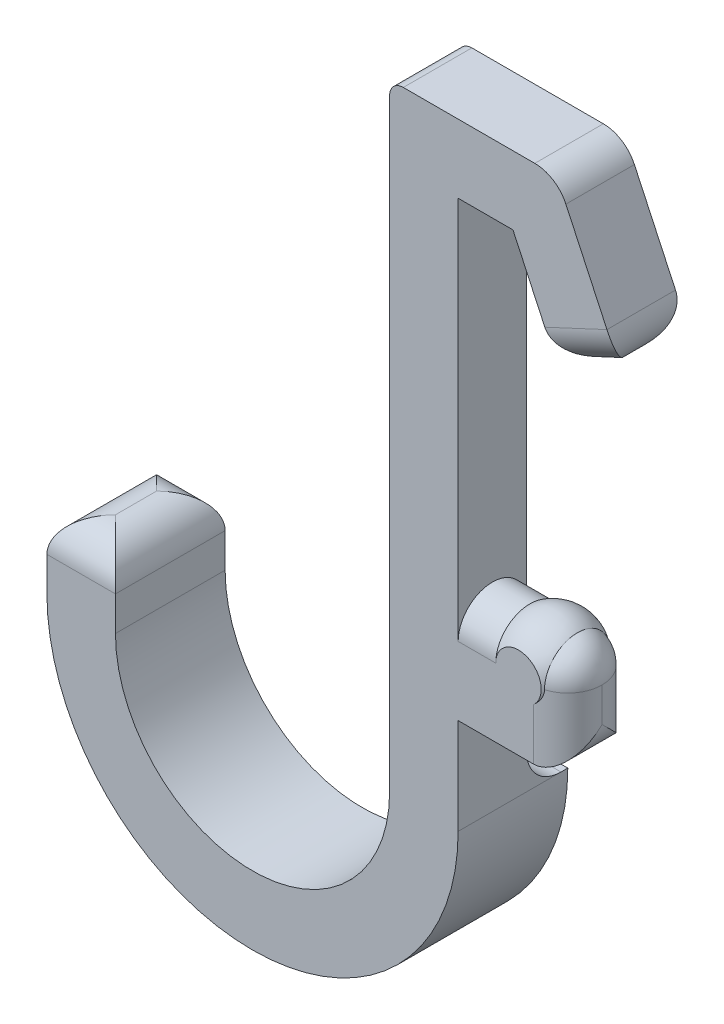
ISO-10303-21;
HEADER;
FILE_DESCRIPTION(('STEP AP214'),'2;1');
FILE_NAME('part.step','',(''),(''),'','','');
FILE_SCHEMA(('AUTOMOTIVE_DESIGN { 1 0 10303 214 1 1 1 1 }'));
ENDSEC;
DATA;
#1=APPLICATION_CONTEXT('core data for automotive mechanical design processes');
#2=APPLICATION_PROTOCOL_DEFINITION('international standard','automotive_design',2000,#1);
#3=PRODUCT_CONTEXT('',#1,'mechanical');
#4=PRODUCT('Part','Part','',(#3));
#5=PRODUCT_RELATED_PRODUCT_CATEGORY('part','',(#4));
#6=PRODUCT_DEFINITION_FORMATION('','',#4);
#7=PRODUCT_DEFINITION_CONTEXT('part definition',#1,'design');
#8=PRODUCT_DEFINITION('design','',#6,#7);
#9=PRODUCT_DEFINITION_SHAPE('','',#8);
#10=(LENGTH_UNIT() NAMED_UNIT(*) SI_UNIT(.MILLI.,.METRE.));
#11=(NAMED_UNIT(*) PLANE_ANGLE_UNIT() SI_UNIT($,.RADIAN.));
#12=(NAMED_UNIT(*) SI_UNIT($,.STERADIAN.) SOLID_ANGLE_UNIT());
#13=UNCERTAINTY_MEASURE_WITH_UNIT(LENGTH_MEASURE(1.E-05),#10,'distance_accuracy_value','');
#14=(GEOMETRIC_REPRESENTATION_CONTEXT(3) GLOBAL_UNCERTAINTY_ASSIGNED_CONTEXT((#13)) GLOBAL_UNIT_ASSIGNED_CONTEXT((#10,
#11,#12)) REPRESENTATION_CONTEXT('',''));
#15=CARTESIAN_POINT('',(0.,0.,0.));
#16=DIRECTION('',(0.,0.,1.));
#17=DIRECTION('',(1.,0.,0.));
#18=AXIS2_PLACEMENT_3D('',#15,#16,#17);
#19=CARTESIAN_POINT('',(-15.,-12.,0.));
#20=DIRECTION('',(0.,0.,1.));
#21=DIRECTION('',(1.,0.,0.));
#22=AXIS2_PLACEMENT_3D('',#19,#20,#21);
#23=PLANE('',#22);
#24=DIRECTION('',(0.,1.,0.));
#25=VECTOR('',#24,1.);
#26=CARTESIAN_POINT('',(0.,-5.,0.));
#27=LINE('',#26,#25);
#28=CARTESIAN_POINT('',(0.,-9.5,0.));
#29=VERTEX_POINT('',#28);
#30=CARTESIAN_POINT('',(0.,-5.,0.));
#31=VERTEX_POINT('',#30);
#32=EDGE_CURVE('E562',#29,#31,#27,.T.);
#33=ORIENTED_EDGE('',*,*,#32,.F.);
#34=DIRECTION('',(1.,0.,0.));
#35=VECTOR('',#34,1.);
#36=CARTESIAN_POINT('',(-4.99999999999999,-9.5,0.));
#37=LINE('',#36,#35);
#38=CARTESIAN_POINT('',(-4.99999999999999,-9.49999999999998,0.));
#39=VERTEX_POINT('',#38);
#40=EDGE_CURVE('E215',#29,#39,#37,.F.);
#41=ORIENTED_EDGE('',*,*,#40,.T.);
#42=DIRECTION('',(0.,-1.,0.));
#43=VECTOR('',#42,1.);
#44=CARTESIAN_POINT('',(-5.,33.,0.));
#45=LINE('',#44,#43);
#46=CARTESIAN_POINT('',(-5.,32.,0.));
#47=VERTEX_POINT('',#46);
#48=EDGE_CURVE('E559',#47,#39,#45,.T.);
#49=ORIENTED_EDGE('',*,*,#48,.F.);
#50=CARTESIAN_POINT('',(-4.,32.,0.));
#51=DIRECTION('',(0.,0.,1.));
#52=DIRECTION('',(1.,0.,0.));
#53=AXIS2_PLACEMENT_3D('',#50,#51,#52);
#54=CIRCLE('',#53,1.);
#55=CARTESIAN_POINT('',(-4.,33.,0.));
#56=VERTEX_POINT('',#55);
#57=EDGE_CURVE('E456',#47,#56,#54,.F.);
#58=ORIENTED_EDGE('',*,*,#57,.T.);
#59=DIRECTION('',(-1.,0.,0.));
#60=VECTOR('',#59,1.);
#61=CARTESIAN_POINT('',(-5.,33.,0.));
#62=LINE('',#61,#60);
#63=CARTESIAN_POINT('',(5.59267565201873,33.,0.));
#64=VERTEX_POINT('',#63);
#65=EDGE_CURVE('E555',#64,#56,#62,.T.);
#66=ORIENTED_EDGE('',*,*,#65,.F.);
#67=CARTESIAN_POINT('',(5.59267565201874,30.5,0.));
#68=DIRECTION('',(0.,0.,1.));
#69=DIRECTION('',(1.,0.,0.));
#70=AXIS2_PLACEMENT_3D('',#67,#68,#69);
#71=CIRCLE('',#70,2.5);
#72=CARTESIAN_POINT('',(7.85844511961037,31.5565456543517,0.));
#73=VERTEX_POINT('',#72);
#74=EDGE_CURVE('E427',#64,#73,#71,.F.);
#75=ORIENTED_EDGE('',*,*,#74,.T.);
#76=DIRECTION('',(-0.422618261740697,0.906307787036651,0.));
#77=VECTOR('',#76,1.);
#78=CARTESIAN_POINT('',(11.9124850291088,22.8626290124103,0.));
#79=LINE('',#78,#77);
#80=CARTESIAN_POINT('',(10.8559393747571,25.1283984800019,0.));
#81=VERTEX_POINT('',#80);
#82=EDGE_CURVE('E551',#81,#73,#79,.T.);
#83=ORIENTED_EDGE('',*,*,#82,.F.);
#84=DIRECTION('',(0.906307787036651,0.422618261740698,0.));
#85=VECTOR('',#84,1.);
#86=CARTESIAN_POINT('',(-24.6029707148278,8.59363715539898,0.));
#87=LINE('',#86,#85);
#88=CARTESIAN_POINT('',(6.32440043957384,23.0153071712984,0.));
#89=VERTEX_POINT('',#88);
#90=EDGE_CURVE('E430',#81,#89,#87,.F.);
#91=ORIENTED_EDGE('',*,*,#90,.T.);
#92=DIRECTION('',(0.422618261740697,-0.906307787036651,0.));
#93=VECTOR('',#92,1.);
#94=CARTESIAN_POINT('',(4.,28.,0.));
#95=LINE('',#94,#93);
#96=CARTESIAN_POINT('',(4.,28.,0.));
#97=VERTEX_POINT('',#96);
#98=EDGE_CURVE('E547',#97,#89,#95,.T.);
#99=ORIENTED_EDGE('',*,*,#98,.F.);
#100=DIRECTION('',(1.,0.,0.));
#101=VECTOR('',#100,1.);
#102=CARTESIAN_POINT('',(0.,28.,0.));
#103=LINE('',#102,#101);
#104=CARTESIAN_POINT('',(0.,28.,0.));
#105=VERTEX_POINT('',#104);
#106=EDGE_CURVE('E544',#105,#97,#103,.T.);
#107=ORIENTED_EDGE('',*,*,#106,.F.);
#108=DIRECTION('',(0.,1.,0.));
#109=VECTOR('',#108,1.);
#110=CARTESIAN_POINT('',(0.,0.,0.));
#111=LINE('',#110,#109);
#112=CARTESIAN_POINT('',(0.,0.,0.));
#113=VERTEX_POINT('',#112);
#114=EDGE_CURVE('E541',#113,#105,#111,.T.);
#115=ORIENTED_EDGE('',*,*,#114,.F.);
#116=DIRECTION('',(-1.,0.,0.));
#117=VECTOR('',#116,1.);
#118=CARTESIAN_POINT('',(0.,0.,0.));
#119=LINE('',#118,#117);
#120=CARTESIAN_POINT('',(2.7416876048223,0.,0.));
#121=VERTEX_POINT('',#120);
#122=EDGE_CURVE('E452',#121,#113,#119,.T.);
#123=ORIENTED_EDGE('',*,*,#122,.F.);
#124=CARTESIAN_POINT('',(4.4,0.,0.));
#125=DIRECTION('',(0.,0.,1.));
#126=DIRECTION('',(1.,0.,0.));
#127=AXIS2_PLACEMENT_3D('',#124,#125,#126);
#128=CIRCLE('',#127,1.6583123951777);
#129=CARTESIAN_POINT('',(5.5,-1.24096736459909,0.));
#130=VERTEX_POINT('',#129);
#131=EDGE_CURVE('E651',#130,#121,#128,.T.);
#132=ORIENTED_EDGE('',*,*,#131,.F.);
#133=DIRECTION('',(0.,1.,0.));
#134=VECTOR('',#133,1.);
#135=CARTESIAN_POINT('',(5.5,-12.,0.));
#136=LINE('',#135,#134);
#137=CARTESIAN_POINT('',(5.5,-5.,0.));
#138=VERTEX_POINT('',#137);
#139=EDGE_CURVE('E468',#130,#138,#136,.F.);
#140=ORIENTED_EDGE('',*,*,#139,.T.);
#141=DIRECTION('',(1.,0.,0.));
#142=VECTOR('',#141,1.);
#143=CARTESIAN_POINT('',(8.,-5.,0.));
#144=LINE('',#143,#142);
#145=EDGE_CURVE('E501',#31,#138,#144,.T.);
#146=ORIENTED_EDGE('',*,*,#145,.F.);
#147=EDGE_LOOP('',(#33,#41,#49,#58,#66,#75,#83,#91,#99,#107,#115,#123,#132,#140,#146));
#148=FACE_BOUND('',#147,.T.);
#149=ADVANCED_FACE('F38',(#148),#23,.F.);
#150=CARTESIAN_POINT('',(13.5901699437495,0.,2.5));
#151=DIRECTION('',(-1.,0.,0.));
#152=DIRECTION('',(0.,0.,1.));
#153=AXIS2_PLACEMENT_3D('',#150,#151,#152);
#154=CYLINDRICAL_SURFACE('',#153,2.5);
#155=CARTESIAN_POINT('',(2.7416876048223,0.,2.5));
#156=DIRECTION('',(1.,0.,0.));
#157=DIRECTION('',(0.,0.,-1.));
#158=AXIS2_PLACEMENT_3D('',#155,#156,#157);
#159=CIRCLE('',#158,2.5);
#160=CARTESIAN_POINT('',(2.7416876048223,0.,5.));
#161=VERTEX_POINT('',#160);
#162=EDGE_CURVE('E277',#121,#161,#159,.T.);
#163=ORIENTED_EDGE('',*,*,#162,.F.);
#164=ORIENTED_EDGE('',*,*,#122,.T.);
#165=CARTESIAN_POINT('',(0.,0.,2.5));
#166=DIRECTION('',(1.,0.,0.));
#167=DIRECTION('',(0.,0.,-1.));
#168=AXIS2_PLACEMENT_3D('',#165,#166,#167);
#169=CIRCLE('',#168,2.5);
#170=CARTESIAN_POINT('',(0.,0.,5.));
#171=VERTEX_POINT('',#170);
#172=EDGE_CURVE('E441',#113,#171,#169,.T.);
#173=ORIENTED_EDGE('',*,*,#172,.T.);
#174=DIRECTION('',(-1.,0.,0.));
#175=VECTOR('',#174,1.);
#176=CARTESIAN_POINT('',(0.,0.,5.));
#177=LINE('',#176,#175);
#178=EDGE_CURVE('E497',#161,#171,#177,.T.);
#179=ORIENTED_EDGE('',*,*,#178,.F.);
#180=EDGE_LOOP('',(#163,#164,#173,#179));
#181=FACE_BOUND('',#180,.T.);
#182=ADVANCED_FACE('F291',(#181),#154,.T.);
#183=CARTESIAN_POINT('',(5.5,0.,2.5));
#184=DIRECTION('',(0.,1.,0.));
#185=DIRECTION('',(0.,0.,1.));
#186=AXIS2_PLACEMENT_3D('',#183,#184,#185);
#187=CYLINDRICAL_SURFACE('',#186,2.5);
#188=ORIENTED_EDGE('',*,*,#139,.F.);
#189=CARTESIAN_POINT('',(5.4998,-1.24114463299005,8.00000016901504E-09));
#190=CARTESIAN_POINT('',(5.5363929673262,-1.2087029649529,-9.26164938524013E-06));
#191=CARTESIAN_POINT('',(5.57236876038989,-1.17555626849876,0.00079770122016531));
#192=CARTESIAN_POINT('',(5.6428030561148,-1.10769667819631,0.00383433659862395));
#193=CARTESIAN_POINT('',(5.67726031215857,-1.07298254322827,0.0060651555671746));
#194=CARTESIAN_POINT('',(5.74519128912905,-1.00095424317269,0.0118132669352872));
#195=CARTESIAN_POINT('',(5.77861573042543,-0.963595826296857,0.0153626740978217));
#196=CARTESIAN_POINT('',(5.84305795009588,-0.886981329738944,0.0234356736079334));
#197=CARTESIAN_POINT('',(5.8740762229525,-0.847725642663384,0.0279590650703918));
#198=CARTESIAN_POINT('',(5.96325201148396,-0.726269508254624,0.042561851108955));
#199=CARTESIAN_POINT('',(6.01705538420124,-0.640865596374251,0.0536260746175859));
#200=CARTESIAN_POINT('',(6.10655009460944,-0.461922147892546,0.074258393974845));
#201=CARTESIAN_POINT('',(6.14249859084772,-0.368522297372846,0.0838462716282918));
#202=CARTESIAN_POINT('',(6.17730370336194,-0.227795718404401,0.0934686773099391));
#203=CARTESIAN_POINT('',(6.18570287472368,-0.1829602446012,0.0958641595546958));
#204=CARTESIAN_POINT('',(6.19710907659667,-0.0920455434275466,0.0991560697495525));
#205=CARTESIAN_POINT('',(6.20005395659277,-0.0459579806521387,0.100035211650277));
#206=CARTESIAN_POINT('',(6.19999998181818,0.000200000000000188,0.0999999946969703));
#207=B_SPLINE_CURVE_WITH_KNOTS('',3,(#189,#190,#191,#192,#193,#194,#195,#196,#197,#198,#199,
#200,#201,#202,#203,#204,#205,#206),.UNSPECIFIED.,.F.,.F.,(4,2,2,2,2,2,2,2,4),(0.,
0.146701218214616,0.29352070649968,0.444179394748281,0.594807039223552,0.898088830284032,
1.196865790681,1.3335683412279,1.47181922641049),.UNSPECIFIED.);
#208=CARTESIAN_POINT('',(6.2,0.,0.100000000000001));
#209=VERTEX_POINT('',#208);
#210=EDGE_CURVE('E267',#130,#209,#207,.T.);
#211=ORIENTED_EDGE('',*,*,#210,.T.);
#212=CARTESIAN_POINT('',(5.5,0.,2.5));
#213=DIRECTION('',(0.,1.,0.));
#214=DIRECTION('',(0.,0.,1.));
#215=AXIS2_PLACEMENT_3D('',#212,#213,#214);
#216=CIRCLE('',#215,2.5);
#217=CARTESIAN_POINT('',(8.,0.,2.5));
#218=VERTEX_POINT('',#217);
#219=EDGE_CURVE('E484',#218,#209,#216,.T.);
#220=ORIENTED_EDGE('',*,*,#219,.F.);
#221=DIRECTION('',(0.,1.,0.));
#222=VECTOR('',#221,1.);
#223=CARTESIAN_POINT('',(8.,0.,2.5));
#224=LINE('',#223,#222);
#225=CARTESIAN_POINT('',(8.,-2.5,2.5));
#226=VERTEX_POINT('',#225);
#227=EDGE_CURVE('E481',#226,#218,#224,.T.);
#228=ORIENTED_EDGE('',*,*,#227,.F.);
#229=CARTESIAN_POINT('',(5.5,-2.5,2.5));
#230=DIRECTION('',(0.,0.707106781186547,-0.707106781186547));
#231=DIRECTION('',(0.,-0.707106781186547,-0.707106781186547));
#232=AXIS2_PLACEMENT_3D('',#229,#230,#231);
#233=ELLIPSE('',#232,3.53553390593274,2.5);
#234=EDGE_CURVE('E307',#138,#226,#233,.F.);
#235=ORIENTED_EDGE('',*,*,#234,.F.);
#236=EDGE_LOOP('',(#188,#211,#220,#228,#235));
#237=FACE_BOUND('',#236,.T.);
#238=ADVANCED_FACE('F279',(#237),#187,.T.);
#239=CARTESIAN_POINT('',(5.5,0.,2.5));
#240=DIRECTION('',(-1.,0.,0.));
#241=DIRECTION('',(0.,0.,1.));
#242=AXIS2_PLACEMENT_3D('',#239,#240,#241);
#243=SPHERICAL_SURFACE('',#242,2.5);
#244=ORIENTED_EDGE('',*,*,#219,.T.);
#245=CARTESIAN_POINT('',(6.2,0.,2.5));
#246=DIRECTION('',(-1.,0.,0.));
#247=DIRECTION('',(0.,0.,1.));
#248=AXIS2_PLACEMENT_3D('',#245,#246,#247);
#249=CIRCLE('',#248,2.4);
#250=CARTESIAN_POINT('',(6.2,0.,4.9));
#251=VERTEX_POINT('',#250);
#252=EDGE_CURVE('E258',#209,#251,#249,.F.);
#253=ORIENTED_EDGE('',*,*,#252,.T.);
#254=CARTESIAN_POINT('',(5.5,0.,2.5));
#255=DIRECTION('',(0.,-1.,0.));
#256=DIRECTION('',(0.,0.,-1.));
#257=AXIS2_PLACEMENT_3D('',#254,#255,#256);
#258=CIRCLE('',#257,2.5);
#259=EDGE_CURVE('E473',#218,#251,#258,.T.);
#260=ORIENTED_EDGE('',*,*,#259,.F.);
#261=EDGE_LOOP('',(#244,#253,#260));
#262=FACE_BOUND('',#261,.T.);
#263=ADVANCED_FACE('F316',(#262),#243,.T.);
#264=CARTESIAN_POINT('',(5.5,-12.,2.5));
#265=DIRECTION('',(0.,-1.,0.));
#266=DIRECTION('',(0.,0.,-1.));
#267=AXIS2_PLACEMENT_3D('',#264,#265,#266);
#268=CYLINDRICAL_SURFACE('',#267,2.5);
#269=ORIENTED_EDGE('',*,*,#259,.T.);
#270=CARTESIAN_POINT('',(6.19999998181818,0.0002,4.90000000530303));
#271=CARTESIAN_POINT('',(6.20002060593483,-0.0340215820751626,4.89998817316831));
#272=CARTESIAN_POINT('',(6.1984143593459,-0.0682209096207423,4.90046286433432));
#273=CARTESIAN_POINT('',(6.19208379810463,-0.136249463080852,4.90229830533756));
#274=CARTESIAN_POINT('',(6.18736474729119,-0.170079215952131,4.90365755930238));
#275=CARTESIAN_POINT('',(6.1689482938362,-0.269536910764676,4.90887369332737));
#276=CARTESIAN_POINT('',(6.15098131886339,-0.334336983187606,4.91387497360715));
#277=CARTESIAN_POINT('',(6.09808868579219,-0.48085117024676,4.92759913373652));
#278=CARTESIAN_POINT('',(6.05953499991633,-0.561148858343043,4.9370045157109));
#279=CARTESIAN_POINT('',(5.97007827325949,-0.715449277029459,4.9558368542023));
#280=CARTESIAN_POINT('',(5.91904380010561,-0.789372868652355,4.96526290588241));
#281=CARTESIAN_POINT('',(5.80922506209963,-0.929818254648965,4.98141526656959));
#282=CARTESIAN_POINT('',(5.75055545651681,-0.996426935956446,4.98817650123594));
#283=CARTESIAN_POINT('',(5.65870838300495,-1.09170672728009,4.99514321976577));
#284=CARTESIAN_POINT('',(5.62774086496115,-1.12244386881611,4.99693401300135));
#285=CARTESIAN_POINT('',(5.56461568283012,-1.1826876244331,4.99936451304459));
#286=CARTESIAN_POINT('',(5.53245860969331,-1.21219483443042,5.00000478377816));
#287=CARTESIAN_POINT('',(5.4998,-1.24114463299005,4.999999992));
#288=B_SPLINE_CURVE_WITH_KNOTS('',3,(#270,#271,#272,#273,#274,#275,#276,#277,#278,#279,#280,
#281,#282,#283,#284,#285,#286,#287),.UNSPECIFIED.,.F.,.F.,(4,2,2,2,2,2,2,2,4),(0.,
0.102583403755103,0.204993779301412,0.406260766109182,0.673486519863847,0.943657669752399,
1.21015973265302,1.34112701736425,1.47203009124063),.UNSPECIFIED.);
#289=CARTESIAN_POINT('',(5.5,-1.24096736459909,5.));
#290=VERTEX_POINT('',#289);
#291=EDGE_CURVE('E295',#251,#290,#288,.T.);
#292=ORIENTED_EDGE('',*,*,#291,.T.);
#293=DIRECTION('',(0.,1.,0.));
#294=VECTOR('',#293,1.);
#295=CARTESIAN_POINT('',(5.5,0.,5.));
#296=LINE('',#295,#294);
#297=CARTESIAN_POINT('',(5.5,-5.,5.));
#298=VERTEX_POINT('',#297);
#299=EDGE_CURVE('E465',#298,#290,#296,.T.);
#300=ORIENTED_EDGE('',*,*,#299,.F.);
#301=CARTESIAN_POINT('',(5.5,-2.5,2.5));
#302=DIRECTION('',(0.,-0.707106781186547,-0.707106781186547));
#303=DIRECTION('',(0.,0.707106781186547,-0.707106781186547));
#304=AXIS2_PLACEMENT_3D('',#301,#302,#303);
#305=ELLIPSE('',#304,3.53553390593274,2.5);
#306=EDGE_CURVE('E477',#298,#226,#305,.F.);
#307=ORIENTED_EDGE('',*,*,#306,.T.);
#308=ORIENTED_EDGE('',*,*,#227,.T.);
#309=EDGE_LOOP('',(#269,#292,#300,#307,#308));
#310=FACE_BOUND('',#309,.T.);
#311=ADVANCED_FACE('F310',(#310),#268,.T.);
#312=CARTESIAN_POINT('',(0.,0.,5.));
#313=DIRECTION('',(-1.,0.,0.));
#314=DIRECTION('',(0.,0.,1.));
#315=AXIS2_PLACEMENT_3D('',#312,#313,#314);
#316=PLANE('',#315);
#317=ORIENTED_EDGE('',*,*,#172,.F.);
#318=ORIENTED_EDGE('',*,*,#114,.T.);
#319=DIRECTION('',(0.,0.,-1.));
#320=VECTOR('',#319,1.);
#321=CARTESIAN_POINT('',(0.,28.,5.));
#322=LINE('',#321,#320);
#323=CARTESIAN_POINT('',(0.,28.,5.));
#324=VERTEX_POINT('',#323);
#325=EDGE_CURVE('E418',#324,#105,#322,.T.);
#326=ORIENTED_EDGE('',*,*,#325,.F.);
#327=DIRECTION('',(0.,1.,0.));
#328=VECTOR('',#327,1.);
#329=CARTESIAN_POINT('',(0.,0.,5.));
#330=LINE('',#329,#328);
#331=EDGE_CURVE('E500',#171,#324,#330,.T.);
#332=ORIENTED_EDGE('',*,*,#331,.F.);
#333=EDGE_LOOP('',(#317,#318,#326,#332));
#334=FACE_BOUND('',#333,.T.);
#335=ADVANCED_FACE('F315',(#334),#316,.F.);
#336=CARTESIAN_POINT('',(0.,28.,5.));
#337=DIRECTION('',(0.,1.,0.));
#338=DIRECTION('',(0.,0.,1.));
#339=AXIS2_PLACEMENT_3D('',#336,#337,#338);
#340=PLANE('',#339);
#341=ORIENTED_EDGE('',*,*,#106,.T.);
#342=DIRECTION('',(0.,0.,-1.));
#343=VECTOR('',#342,1.);
#344=CARTESIAN_POINT('',(4.,28.,5.));
#345=LINE('',#344,#343);
#346=CARTESIAN_POINT('',(4.,28.,5.));
#347=VERTEX_POINT('',#346);
#348=EDGE_CURVE('E578',#347,#97,#345,.T.);
#349=ORIENTED_EDGE('',*,*,#348,.F.);
#350=DIRECTION('',(1.,0.,0.));
#351=VECTOR('',#350,1.);
#352=CARTESIAN_POINT('',(0.,28.,5.));
#353=LINE('',#352,#351);
#354=EDGE_CURVE('E504',#324,#347,#353,.T.);
#355=ORIENTED_EDGE('',*,*,#354,.F.);
#356=ORIENTED_EDGE('',*,*,#325,.T.);
#357=EDGE_LOOP('',(#341,#349,#355,#356));
#358=FACE_BOUND('',#357,.T.);
#359=ADVANCED_FACE('F372',(#358),#340,.F.);
#360=CARTESIAN_POINT('',(4.,28.,5.));
#361=DIRECTION('',(0.906307787036651,0.422618261740697,0.));
#362=DIRECTION('',(-0.422618261740697,0.906307787036651,0.));
#363=AXIS2_PLACEMENT_3D('',#360,#361,#362);
#364=PLANE('',#363);
#365=ORIENTED_EDGE('',*,*,#98,.T.);
#366=DIRECTION('',(0.,0.,-1.));
#367=VECTOR('',#366,1.);
#368=CARTESIAN_POINT('',(6.32440043957383,23.0153071712984,5.));
#369=LINE('',#368,#367);
#370=CARTESIAN_POINT('',(6.32440043957383,23.0153071712984,5.));
#371=VERTEX_POINT('',#370);
#372=EDGE_CURVE('E412',#89,#371,#369,.F.);
#373=ORIENTED_EDGE('',*,*,#372,.T.);
#374=DIRECTION('',(0.422618261740697,-0.906307787036651,0.));
#375=VECTOR('',#374,1.);
#376=CARTESIAN_POINT('',(4.,28.,5.));
#377=LINE('',#376,#375);
#378=EDGE_CURVE('E507',#347,#371,#377,.T.);
#379=ORIENTED_EDGE('',*,*,#378,.F.);
#380=ORIENTED_EDGE('',*,*,#348,.T.);
#381=EDGE_LOOP('',(#365,#373,#379,#380));
#382=FACE_BOUND('',#381,.T.);
#383=ADVANCED_FACE('F368',(#382),#364,.F.);
#384=CARTESIAN_POINT('',(11.9124850291088,22.8626290124103,5.));
#385=DIRECTION('',(-0.906307787036651,-0.422618261740697,0.));
#386=DIRECTION('',(0.422618261740697,-0.906307787036651,0.));
#387=AXIS2_PLACEMENT_3D('',#384,#385,#386);
#388=PLANE('',#387);
#389=DIRECTION('',(-0.422618261740697,0.906307787036651,0.));
#390=VECTOR('',#389,1.);
#391=CARTESIAN_POINT('',(11.9124850291088,22.8626290124103,5.));
#392=LINE('',#391,#390);
#393=CARTESIAN_POINT('',(10.8559393747571,25.1283984800019,5.));
#394=VERTEX_POINT('',#393);
#395=CARTESIAN_POINT('',(7.85844511961037,31.5565456543517,5.));
#396=VERTEX_POINT('',#395);
#397=EDGE_CURVE('E511',#394,#396,#392,.T.);
#398=ORIENTED_EDGE('',*,*,#397,.F.);
#399=DIRECTION('',(0.,0.,-1.));
#400=VECTOR('',#399,1.);
#401=CARTESIAN_POINT('',(10.8559393747571,25.1283984800019,5.));
#402=LINE('',#401,#400);
#403=EDGE_CURVE('E424',#394,#81,#402,.T.);
#404=ORIENTED_EDGE('',*,*,#403,.T.);
#405=ORIENTED_EDGE('',*,*,#82,.T.);
#406=DIRECTION('',(0.,0.,-1.));
#407=VECTOR('',#406,1.);
#408=CARTESIAN_POINT('',(7.85844511961037,31.5565456543517,5.));
#409=LINE('',#408,#407);
#410=EDGE_CURVE('E403',#73,#396,#409,.F.);
#411=ORIENTED_EDGE('',*,*,#410,.T.);
#412=EDGE_LOOP('',(#398,#404,#405,#411));
#413=FACE_BOUND('',#412,.T.);
#414=ADVANCED_FACE('F364',(#413),#388,.F.);
#415=CARTESIAN_POINT('',(-5.,33.,5.));
#416=DIRECTION('',(0.,-1.,0.));
#417=DIRECTION('',(0.,0.,-1.));
#418=AXIS2_PLACEMENT_3D('',#415,#416,#417);
#419=PLANE('',#418);
#420=ORIENTED_EDGE('',*,*,#65,.T.);
#421=DIRECTION('',(0.,0.,-1.));
#422=VECTOR('',#421,1.);
#423=CARTESIAN_POINT('',(-4.,33.,5.));
#424=LINE('',#423,#422);
#425=CARTESIAN_POINT('',(-4.,33.,5.));
#426=VERTEX_POINT('',#425);
#427=EDGE_CURVE('E459',#56,#426,#424,.F.);
#428=ORIENTED_EDGE('',*,*,#427,.T.);
#429=DIRECTION('',(-1.,0.,0.));
#430=VECTOR('',#429,1.);
#431=CARTESIAN_POINT('',(-5.,33.,5.));
#432=LINE('',#431,#430);
#433=CARTESIAN_POINT('',(5.59267565201873,33.,5.));
#434=VERTEX_POINT('',#433);
#435=EDGE_CURVE('E514',#434,#426,#432,.T.);
#436=ORIENTED_EDGE('',*,*,#435,.F.);
#437=DIRECTION('',(0.,0.,-1.));
#438=VECTOR('',#437,1.);
#439=CARTESIAN_POINT('',(5.59267565201874,33.,5.));
#440=LINE('',#439,#438);
#441=EDGE_CURVE('E405',#434,#64,#440,.T.);
#442=ORIENTED_EDGE('',*,*,#441,.T.);
#443=EDGE_LOOP('',(#420,#428,#436,#442));
#444=FACE_BOUND('',#443,.T.);
#445=ADVANCED_FACE('F360',(#444),#419,.F.);
#446=CARTESIAN_POINT('',(-5.,33.,5.));
#447=DIRECTION('',(1.,0.,0.));
#448=DIRECTION('',(0.,1.,0.));
#449=AXIS2_PLACEMENT_3D('',#446,#447,#448);
#450=PLANE('',#449);
#451=DIRECTION('',(0.,-1.,0.));
#452=VECTOR('',#451,1.);
#453=CARTESIAN_POINT('',(-5.,33.,5.));
#454=LINE('',#453,#452);
#455=CARTESIAN_POINT('',(-5.,32.,5.));
#456=VERTEX_POINT('',#455);
#457=CARTESIAN_POINT('',(-4.99999999999999,-12.,5.));
#458=VERTEX_POINT('',#457);
#459=EDGE_CURVE('E517',#456,#458,#454,.T.);
#460=ORIENTED_EDGE('',*,*,#459,.F.);
#461=DIRECTION('',(0.,0.,-1.));
#462=VECTOR('',#461,1.);
#463=CARTESIAN_POINT('',(-5.,32.,5.));
#464=LINE('',#463,#462);
#465=EDGE_CURVE('E435',#456,#47,#464,.T.);
#466=ORIENTED_EDGE('',*,*,#465,.T.);
#467=ORIENTED_EDGE('',*,*,#48,.T.);
#468=CARTESIAN_POINT('',(-4.99999999999999,-9.5,-2.5));
#469=DIRECTION('',(1.,0.,0.));
#470=DIRECTION('',(0.,1.,0.));
#471=AXIS2_PLACEMENT_3D('',#468,#469,#470);
#472=CIRCLE('',#471,2.5);
#473=CARTESIAN_POINT('',(-4.99999999999999,-12.,-2.5));
#474=VERTEX_POINT('',#473);
#475=EDGE_CURVE('E11',#39,#474,#472,.T.);
#476=ORIENTED_EDGE('',*,*,#475,.T.);
#477=DIRECTION('',(0.,0.,-1.));
#478=VECTOR('',#477,1.);
#479=CARTESIAN_POINT('',(-4.99999999999999,-12.,5.));
#480=LINE('',#479,#478);
#481=EDGE_CURVE('E58',#458,#474,#480,.T.);
#482=ORIENTED_EDGE('',*,*,#481,.F.);
#483=EDGE_LOOP('',(#460,#466,#467,#476,#482));
#484=FACE_BOUND('',#483,.T.);
#485=ADVANCED_FACE('F357',(#484),#450,.F.);
#486=CARTESIAN_POINT('',(-15.,-12.,5.));
#487=DIRECTION('',(0.,0.,-1.));
#488=DIRECTION('',(-1.,0.,0.));
#489=AXIS2_PLACEMENT_3D('',#486,#487,#488);
#490=CYLINDRICAL_SURFACE('',#489,10.);
#491=ORIENTED_EDGE('',*,*,#481,.T.);
#492=DIRECTION('',(0.,0.,1.));
#493=VECTOR('',#492,1.);
#494=CARTESIAN_POINT('',(-4.99999999999999,-12.,-3.));
#495=LINE('',#494,#493);
#496=CARTESIAN_POINT('',(-4.99999999999999,-12.,-3.));
#497=VERTEX_POINT('',#496);
#498=EDGE_CURVE('E246',#497,#474,#495,.T.);
#499=ORIENTED_EDGE('',*,*,#498,.F.);
#500=CARTESIAN_POINT('',(-15.,-12.,-3.));
#501=DIRECTION('',(0.,0.,1.));
#502=DIRECTION('',(-1.,0.,0.));
#503=AXIS2_PLACEMENT_3D('',#500,#501,#502);
#504=CIRCLE('',#503,10.);
#505=CARTESIAN_POINT('',(-25.,-12.,-3.));
#506=VERTEX_POINT('',#505);
#507=EDGE_CURVE('E610',#506,#497,#504,.T.);
#508=ORIENTED_EDGE('',*,*,#507,.F.);
#509=DIRECTION('',(0.,0.,-1.));
#510=VECTOR('',#509,1.);
#511=CARTESIAN_POINT('',(-25.,-12.,5.));
#512=LINE('',#511,#510);
#513=CARTESIAN_POINT('',(-25.,-12.,5.));
#514=VERTEX_POINT('',#513);
#515=EDGE_CURVE('E573',#514,#506,#512,.T.);
#516=ORIENTED_EDGE('',*,*,#515,.F.);
#517=CARTESIAN_POINT('',(-15.,-12.,5.));
#518=DIRECTION('',(0.,0.,-1.));
#519=DIRECTION('',(1.,0.,0.));
#520=AXIS2_PLACEMENT_3D('',#517,#518,#519);
#521=CIRCLE('',#520,10.);
#522=EDGE_CURVE('E520',#458,#514,#521,.T.);
#523=ORIENTED_EDGE('',*,*,#522,.F.);
#524=EDGE_LOOP('',(#491,#499,#508,#516,#523));
#525=FACE_BOUND('',#524,.T.);
#526=ADVANCED_FACE('F353',(#525),#490,.F.);
#527=CARTESIAN_POINT('',(-25.,-12.,5.));
#528=DIRECTION('',(-1.,0.,0.));
#529=DIRECTION('',(0.,0.,1.));
#530=AXIS2_PLACEMENT_3D('',#527,#528,#529);
#531=PLANE('',#530);
#532=DIRECTION('',(0.,-1.,0.));
#533=VECTOR('',#532,1.);
#534=CARTESIAN_POINT('',(-25.,-12.,-3.));
#535=LINE('',#534,#533);
#536=CARTESIAN_POINT('',(-25.,-9.49999999999999,-3.));
#537=VERTEX_POINT('',#536);
#538=EDGE_CURVE('E84',#537,#506,#535,.T.);
#539=ORIENTED_EDGE('',*,*,#538,.F.);
#540=DIRECTION('',(0.,0.,-1.));
#541=VECTOR('',#540,1.);
#542=CARTESIAN_POINT('',(-25.,-9.49999999999999,5.));
#543=LINE('',#542,#541);
#544=CARTESIAN_POINT('',(-25.,-9.49999999999999,5.));
#545=VERTEX_POINT('',#544);
#546=EDGE_CURVE('E248',#537,#545,#543,.F.);
#547=ORIENTED_EDGE('',*,*,#546,.T.);
#548=DIRECTION('',(0.,1.,0.));
#549=VECTOR('',#548,1.);
#550=CARTESIAN_POINT('',(-25.,-12.,5.));
#551=LINE('',#550,#549);
#552=EDGE_CURVE('E523',#514,#545,#551,.T.);
#553=ORIENTED_EDGE('',*,*,#552,.F.);
#554=ORIENTED_EDGE('',*,*,#515,.T.);
#555=EDGE_LOOP('',(#539,#547,#553,#554));
#556=FACE_BOUND('',#555,.T.);
#557=ADVANCED_FACE('F349',(#556),#531,.F.);
#558=CARTESIAN_POINT('',(-30.,-6.99999999999999,5.));
#559=DIRECTION('',(1.,0.,0.));
#560=DIRECTION('',(0.,0.,-1.));
#561=AXIS2_PLACEMENT_3D('',#558,#559,#560);
#562=PLANE('',#561);
#563=DIRECTION('',(0.,-1.,0.));
#564=VECTOR('',#563,1.);
#565=CARTESIAN_POINT('',(-30.,-6.99999999999999,5.));
#566=LINE('',#565,#564);
#567=CARTESIAN_POINT('',(-30.,-9.49999999999999,5.));
#568=VERTEX_POINT('',#567);
#569=CARTESIAN_POINT('',(-30.,-12.,5.));
#570=VERTEX_POINT('',#569);
#571=EDGE_CURVE('E527',#568,#570,#566,.T.);
#572=ORIENTED_EDGE('',*,*,#571,.F.);
#573=DIRECTION('',(0.,0.,-1.));
#574=VECTOR('',#573,1.);
#575=CARTESIAN_POINT('',(-30.,-9.49999999999999,5.));
#576=LINE('',#575,#574);
#577=CARTESIAN_POINT('',(-30.,-9.49999999999999,-3.));
#578=VERTEX_POINT('',#577);
#579=EDGE_CURVE('E615',#568,#578,#576,.T.);
#580=ORIENTED_EDGE('',*,*,#579,.T.);
#581=DIRECTION('',(0.,1.,0.));
#582=VECTOR('',#581,1.);
#583=CARTESIAN_POINT('',(-30.,-6.99999999999999,-3.));
#584=LINE('',#583,#582);
#585=CARTESIAN_POINT('',(-30.,-12.,-3.));
#586=VERTEX_POINT('',#585);
#587=EDGE_CURVE('E254',#586,#578,#584,.T.);
#588=ORIENTED_EDGE('',*,*,#587,.F.);
#589=DIRECTION('',(0.,0.,-1.));
#590=VECTOR('',#589,1.);
#591=CARTESIAN_POINT('',(-30.,-12.,5.));
#592=LINE('',#591,#590);
#593=EDGE_CURVE('E230',#570,#586,#592,.T.);
#594=ORIENTED_EDGE('',*,*,#593,.F.);
#595=EDGE_LOOP('',(#572,#580,#588,#594));
#596=FACE_BOUND('',#595,.T.);
#597=ADVANCED_FACE('F346',(#596),#562,.F.);
#598=CARTESIAN_POINT('',(-15.,-12.,5.));
#599=DIRECTION('',(0.,0.,-1.));
#600=DIRECTION('',(-1.,0.,0.));
#601=AXIS2_PLACEMENT_3D('',#598,#599,#600);
#602=CYLINDRICAL_SURFACE('',#601,15.);
#603=ORIENTED_EDGE('',*,*,#593,.T.);
#604=CARTESIAN_POINT('',(-15.,-12.,-3.));
#605=DIRECTION('',(0.,0.,-1.));
#606=DIRECTION('',(-1.,0.,0.));
#607=AXIS2_PLACEMENT_3D('',#604,#605,#606);
#608=CIRCLE('',#607,15.);
#609=CARTESIAN_POINT('',(0.,-12.,-3.));
#610=VERTEX_POINT('',#609);
#611=EDGE_CURVE('E252',#610,#586,#608,.T.);
#612=ORIENTED_EDGE('',*,*,#611,.F.);
#613=DIRECTION('',(0.,0.,1.));
#614=VECTOR('',#613,1.);
#615=CARTESIAN_POINT('',(0.,-12.,-3.));
#616=LINE('',#615,#614);
#617=CARTESIAN_POINT('',(0.,-12.,-2.5));
#618=VERTEX_POINT('',#617);
#619=EDGE_CURVE('E244',#610,#618,#616,.T.);
#620=ORIENTED_EDGE('',*,*,#619,.T.);
#621=DIRECTION('',(0.,0.,-1.));
#622=VECTOR('',#621,1.);
#623=CARTESIAN_POINT('',(0.,-12.,5.));
#624=LINE('',#623,#622);
#625=CARTESIAN_POINT('',(0.,-12.,5.));
#626=VERTEX_POINT('',#625);
#627=EDGE_CURVE('E221',#626,#618,#624,.T.);
#628=ORIENTED_EDGE('',*,*,#627,.F.);
#629=CARTESIAN_POINT('',(-15.,-12.,5.));
#630=DIRECTION('',(0.,0.,1.));
#631=DIRECTION('',(1.,0.,0.));
#632=AXIS2_PLACEMENT_3D('',#629,#630,#631);
#633=CIRCLE('',#632,15.);
#634=EDGE_CURVE('E530',#570,#626,#633,.T.);
#635=ORIENTED_EDGE('',*,*,#634,.F.);
#636=EDGE_LOOP('',(#603,#612,#620,#628,#635));
#637=FACE_BOUND('',#636,.T.);
#638=ADVANCED_FACE('F250',(#637),#602,.T.);
#639=CARTESIAN_POINT('',(0.,-5.,5.));
#640=DIRECTION('',(-1.,0.,0.));
#641=DIRECTION('',(0.,-1.,0.));
#642=AXIS2_PLACEMENT_3D('',#639,#640,#641);
#643=PLANE('',#642);
#644=ORIENTED_EDGE('',*,*,#627,.T.);
#645=CARTESIAN_POINT('',(0.,-9.5,-2.5));
#646=DIRECTION('',(-1.,0.,0.));
#647=DIRECTION('',(0.,-1.,0.));
#648=AXIS2_PLACEMENT_3D('',#645,#646,#647);
#649=CIRCLE('',#648,2.5);
#650=EDGE_CURVE('E49',#618,#29,#649,.T.);
#651=ORIENTED_EDGE('',*,*,#650,.T.);
#652=ORIENTED_EDGE('',*,*,#32,.T.);
#653=DIRECTION('',(0.,0.,-1.));
#654=VECTOR('',#653,1.);
#655=CARTESIAN_POINT('',(0.,-5.,5.));
#656=LINE('',#655,#654);
#657=CARTESIAN_POINT('',(0.,-5.,5.));
#658=VERTEX_POINT('',#657);
#659=EDGE_CURVE('E231',#658,#31,#656,.T.);
#660=ORIENTED_EDGE('',*,*,#659,.F.);
#661=DIRECTION('',(0.,1.,0.));
#662=VECTOR('',#661,1.);
#663=CARTESIAN_POINT('',(0.,-5.,5.));
#664=LINE('',#663,#662);
#665=EDGE_CURVE('E225',#626,#658,#664,.T.);
#666=ORIENTED_EDGE('',*,*,#665,.F.);
#667=EDGE_LOOP('',(#644,#651,#652,#660,#666));
#668=FACE_BOUND('',#667,.T.);
#669=ADVANCED_FACE('F223',(#668),#643,.F.);
#670=CARTESIAN_POINT('',(8.,-5.,5.));
#671=DIRECTION('',(0.,1.,0.));
#672=DIRECTION('',(0.,0.,1.));
#673=AXIS2_PLACEMENT_3D('',#670,#671,#672);
#674=PLANE('',#673);
#675=ORIENTED_EDGE('',*,*,#145,.T.);
#676=DIRECTION('',(0.,0.,-1.));
#677=VECTOR('',#676,1.);
#678=CARTESIAN_POINT('',(5.5,-5.,5.));
#679=LINE('',#678,#677);
#680=EDGE_CURVE('E306',#138,#298,#679,.F.);
#681=ORIENTED_EDGE('',*,*,#680,.T.);
#682=DIRECTION('',(1.,0.,0.));
#683=VECTOR('',#682,1.);
#684=CARTESIAN_POINT('',(8.,-5.,5.));
#685=LINE('',#684,#683);
#686=EDGE_CURVE('E535',#658,#298,#685,.T.);
#687=ORIENTED_EDGE('',*,*,#686,.F.);
#688=ORIENTED_EDGE('',*,*,#659,.T.);
#689=EDGE_LOOP('',(#675,#681,#687,#688));
#690=FACE_BOUND('',#689,.T.);
#691=ADVANCED_FACE('F338',(#690),#674,.F.);
#692=CARTESIAN_POINT('',(-15.,-12.,5.));
#693=DIRECTION('',(0.,0.,1.));
#694=DIRECTION('',(1.,0.,0.));
#695=AXIS2_PLACEMENT_3D('',#692,#693,#694);
#696=PLANE('',#695);
#697=ORIENTED_EDGE('',*,*,#552,.T.);
#698=DIRECTION('',(-1.,0.,0.));
#699=VECTOR('',#698,1.);
#700=CARTESIAN_POINT('',(-30.,-9.49999999999999,5.));
#701=LINE('',#700,#699);
#702=EDGE_CURVE('E649',#545,#568,#701,.T.);
#703=ORIENTED_EDGE('',*,*,#702,.T.);
#704=ORIENTED_EDGE('',*,*,#571,.T.);
#705=ORIENTED_EDGE('',*,*,#634,.T.);
#706=ORIENTED_EDGE('',*,*,#665,.T.);
#707=ORIENTED_EDGE('',*,*,#686,.T.);
#708=ORIENTED_EDGE('',*,*,#299,.T.);
#709=CARTESIAN_POINT('',(4.4,0.,5.));
#710=DIRECTION('',(0.,0.,-1.));
#711=DIRECTION('',(-1.,0.,0.));
#712=AXIS2_PLACEMENT_3D('',#709,#710,#711);
#713=CIRCLE('',#712,1.6583123951777);
#714=EDGE_CURVE('E305',#161,#290,#713,.T.);
#715=ORIENTED_EDGE('',*,*,#714,.F.);
#716=ORIENTED_EDGE('',*,*,#178,.T.);
#717=ORIENTED_EDGE('',*,*,#331,.T.);
#718=ORIENTED_EDGE('',*,*,#354,.T.);
#719=ORIENTED_EDGE('',*,*,#378,.T.);
#720=DIRECTION('',(0.906307787036651,0.422618261740698,0.));
#721=VECTOR('',#720,1.);
#722=CARTESIAN_POINT('',(10.8559393747571,25.1283984800019,5.));
#723=LINE('',#722,#721);
#724=EDGE_CURVE('E411',#371,#394,#723,.T.);
#725=ORIENTED_EDGE('',*,*,#724,.T.);
#726=ORIENTED_EDGE('',*,*,#397,.T.);
#727=CARTESIAN_POINT('',(5.59267565201874,30.5,5.));
#728=DIRECTION('',(0.,0.,1.));
#729=DIRECTION('',(1.,0.,0.));
#730=AXIS2_PLACEMENT_3D('',#727,#728,#729);
#731=CIRCLE('',#730,2.5);
#732=EDGE_CURVE('E402',#396,#434,#731,.T.);
#733=ORIENTED_EDGE('',*,*,#732,.T.);
#734=ORIENTED_EDGE('',*,*,#435,.T.);
#735=CARTESIAN_POINT('',(-4.,32.,5.));
#736=DIRECTION('',(0.,0.,1.));
#737=DIRECTION('',(1.,0.,0.));
#738=AXIS2_PLACEMENT_3D('',#735,#736,#737);
#739=CIRCLE('',#738,1.);
#740=EDGE_CURVE('E462',#426,#456,#739,.T.);
#741=ORIENTED_EDGE('',*,*,#740,.T.);
#742=ORIENTED_EDGE('',*,*,#459,.T.);
#743=ORIENTED_EDGE('',*,*,#522,.T.);
#744=EDGE_LOOP('',(#697,#703,#704,#705,#706,#707,#708,#715,#716,#717,#718,#719,#725,#726,#733,
#734,#741,#742,#743));
#745=FACE_BOUND('',#744,.T.);
#746=ADVANCED_FACE('F337',(#745),#696,.T.);
#747=CARTESIAN_POINT('',(8.59016990716546,24.0718528256502,5.));
#748=DIRECTION('',(0.,0.,-1.));
#749=DIRECTION('',(-1.,0.,0.));
#750=AXIS2_PLACEMENT_3D('',#747,#748,#749);
#751=CYLINDRICAL_SURFACE('',#750,2.5);
#752=CARTESIAN_POINT('',(8.59016990716546,24.0718528256502,2.5));
#753=DIRECTION('',(0.640856382055789,0.298836238730119,0.707106781186547));
#754=DIRECTION('',(0.640856382055789,0.298836238730119,-0.707106781186547));
#755=AXIS2_PLACEMENT_3D('',#752,#753,#754);
#756=ELLIPSE('',#755,3.53553390593274,2.5);
#757=CARTESIAN_POINT('',(9.64671556151721,21.8060833580585,2.5));
#758=VERTEX_POINT('',#757);
#759=EDGE_CURVE('E444',#81,#758,#756,.F.);
#760=ORIENTED_EDGE('',*,*,#759,.F.);
#761=ORIENTED_EDGE('',*,*,#403,.F.);
#762=CARTESIAN_POINT('',(8.59016990716546,24.0718528256502,2.5));
#763=DIRECTION('',(0.640856382055789,0.298836238730119,-0.707106781186547));
#764=DIRECTION('',(-0.640856382055789,-0.298836238730119,-0.707106781186547));
#765=AXIS2_PLACEMENT_3D('',#762,#763,#764);
#766=ELLIPSE('',#765,3.53553390593274,2.5);
#767=EDGE_CURVE('E448',#758,#394,#766,.F.);
#768=ORIENTED_EDGE('',*,*,#767,.F.);
#769=EDGE_LOOP('',(#760,#761,#768));
#770=FACE_BOUND('',#769,.T.);
#771=ADVANCED_FACE('F391',(#770),#751,.T.);
#772=CARTESIAN_POINT('',(-24.6029707148278,8.59363715539898,2.5));
#773=DIRECTION('',(-0.906307787036651,-0.422618261740698,0.));
#774=DIRECTION('',(0.422618261740698,-0.906307787036651,0.));
#775=AXIS2_PLACEMENT_3D('',#772,#773,#774);
#776=CYLINDRICAL_SURFACE('',#775,2.5);
#777=ORIENTED_EDGE('',*,*,#767,.T.);
#778=ORIENTED_EDGE('',*,*,#724,.F.);
#779=CARTESIAN_POINT('',(8.59016990716546,24.0718528256502,2.5));
#780=DIRECTION('',(-0.640856382055789,-0.298836238730119,-0.707106781186547));
#781=DIRECTION('',(-0.640856382055789,-0.298836238730119,0.707106781186547));
#782=AXIS2_PLACEMENT_3D('',#779,#780,#781);
#783=ELLIPSE('',#782,3.53553390593274,2.5);
#784=EDGE_CURVE('E440',#758,#371,#783,.T.);
#785=ORIENTED_EDGE('',*,*,#784,.F.);
#786=EDGE_LOOP('',(#777,#778,#785));
#787=FACE_BOUND('',#786,.T.);
#788=ADVANCED_FACE('F387',(#787),#776,.T.);
#789=CARTESIAN_POINT('',(6.32440043957383,23.0153071712984,2.5));
#790=DIRECTION('',(0.906307787036651,0.422618261740698,0.));
#791=DIRECTION('',(-0.422618261740698,0.906307787036651,0.));
#792=AXIS2_PLACEMENT_3D('',#789,#790,#791);
#793=CYLINDRICAL_SURFACE('',#792,2.5);
#794=ORIENTED_EDGE('',*,*,#90,.F.);
#795=ORIENTED_EDGE('',*,*,#759,.T.);
#796=CARTESIAN_POINT('',(8.59016990716546,24.0718528256502,2.5));
#797=DIRECTION('',(0.640856382055789,0.298836238730119,-0.707106781186547));
#798=DIRECTION('',(0.640856382055789,0.298836238730119,0.707106781186547));
#799=AXIS2_PLACEMENT_3D('',#796,#797,#798);
#800=ELLIPSE('',#799,3.53553390593274,2.5);
#801=EDGE_CURVE('E436',#89,#758,#800,.F.);
#802=ORIENTED_EDGE('',*,*,#801,.F.);
#803=EDGE_LOOP('',(#794,#795,#802));
#804=FACE_BOUND('',#803,.T.);
#805=ADVANCED_FACE('F383',(#804),#793,.T.);
#806=CARTESIAN_POINT('',(8.59016990716546,24.0718528256502,5.));
#807=DIRECTION('',(0.,0.,-1.));
#808=DIRECTION('',(-1.,0.,0.));
#809=AXIS2_PLACEMENT_3D('',#806,#807,#808);
#810=CYLINDRICAL_SURFACE('',#809,2.5);
#811=ORIENTED_EDGE('',*,*,#784,.T.);
#812=ORIENTED_EDGE('',*,*,#372,.F.);
#813=ORIENTED_EDGE('',*,*,#801,.T.);
#814=EDGE_LOOP('',(#811,#812,#813));
#815=FACE_BOUND('',#814,.T.);
#816=ADVANCED_FACE('F380',(#815),#810,.T.);
#817=CARTESIAN_POINT('',(5.59267565201874,30.5,5.));
#818=DIRECTION('',(0.,0.,-1.));
#819=DIRECTION('',(-1.,0.,0.));
#820=AXIS2_PLACEMENT_3D('',#817,#818,#819);
#821=CYLINDRICAL_SURFACE('',#820,2.5);
#822=ORIENTED_EDGE('',*,*,#732,.F.);
#823=ORIENTED_EDGE('',*,*,#410,.F.);
#824=ORIENTED_EDGE('',*,*,#74,.F.);
#825=ORIENTED_EDGE('',*,*,#441,.F.);
#826=EDGE_LOOP('',(#822,#823,#824,#825));
#827=FACE_BOUND('',#826,.T.);
#828=ADVANCED_FACE('F327',(#827),#821,.T.);
#829=CARTESIAN_POINT('',(-4.,32.,5.));
#830=DIRECTION('',(0.,0.,-1.));
#831=DIRECTION('',(-1.,0.,0.));
#832=AXIS2_PLACEMENT_3D('',#829,#830,#831);
#833=CYLINDRICAL_SURFACE('',#832,1.);
#834=ORIENTED_EDGE('',*,*,#740,.F.);
#835=ORIENTED_EDGE('',*,*,#427,.F.);
#836=ORIENTED_EDGE('',*,*,#57,.F.);
#837=ORIENTED_EDGE('',*,*,#465,.F.);
#838=EDGE_LOOP('',(#834,#835,#836,#837));
#839=FACE_BOUND('',#838,.T.);
#840=ADVANCED_FACE('F318',(#839),#833,.T.);
#841=CARTESIAN_POINT('',(5.5,-2.5,5.));
#842=DIRECTION('',(0.,0.,-1.));
#843=DIRECTION('',(-1.,0.,0.));
#844=AXIS2_PLACEMENT_3D('',#841,#842,#843);
#845=CYLINDRICAL_SURFACE('',#844,2.5);
#846=ORIENTED_EDGE('',*,*,#680,.F.);
#847=ORIENTED_EDGE('',*,*,#234,.T.);
#848=ORIENTED_EDGE('',*,*,#306,.F.);
#849=EDGE_LOOP('',(#846,#847,#848));
#850=FACE_BOUND('',#849,.T.);
#851=ADVANCED_FACE('F288',(#850),#845,.T.);
#852=CARTESIAN_POINT('',(4.4,0.,2.5));
#853=DIRECTION('',(0.,0.,1.));
#854=DIRECTION('',(0.,1.,0.));
#855=AXIS2_PLACEMENT_3D('',#852,#853,#854);
#856=SPHERICAL_SURFACE('',#855,3.);
#857=ORIENTED_EDGE('',*,*,#210,.F.);
#858=ORIENTED_EDGE('',*,*,#131,.T.);
#859=ORIENTED_EDGE('',*,*,#162,.T.);
#860=ORIENTED_EDGE('',*,*,#714,.T.);
#861=ORIENTED_EDGE('',*,*,#291,.F.);
#862=ORIENTED_EDGE('',*,*,#252,.F.);
#863=EDGE_LOOP('',(#857,#858,#859,#860,#861,#862));
#864=FACE_BOUND('',#863,.T.);
#865=ADVANCED_FACE('F283',(#864),#856,.T.);
#866=CARTESIAN_POINT('',(0.,-12.,-3.));
#867=DIRECTION('',(0.,-1.,0.));
#868=DIRECTION('',(0.,0.,-1.));
#869=AXIS2_PLACEMENT_3D('',#866,#867,#868);
#870=PLANE('',#869);
#871=ORIENTED_EDGE('',*,*,#498,.T.);
#872=DIRECTION('',(1.,0.,0.));
#873=VECTOR('',#872,1.);
#874=CARTESIAN_POINT('',(0.,-12.,-2.5));
#875=LINE('',#874,#873);
#876=EDGE_CURVE('E237',#474,#618,#875,.T.);
#877=ORIENTED_EDGE('',*,*,#876,.T.);
#878=ORIENTED_EDGE('',*,*,#619,.F.);
#879=DIRECTION('',(1.,0.,0.));
#880=VECTOR('',#879,1.);
#881=CARTESIAN_POINT('',(0.,-12.,-3.));
#882=LINE('',#881,#880);
#883=EDGE_CURVE('E637',#497,#610,#882,.T.);
#884=ORIENTED_EDGE('',*,*,#883,.F.);
#885=EDGE_LOOP('',(#871,#877,#878,#884));
#886=FACE_BOUND('',#885,.T.);
#887=ADVANCED_FACE('F242',(#886),#870,.F.);
#888=CARTESIAN_POINT('',(-15.,-12.,-3.));
#889=DIRECTION('',(0.,0.,-1.));
#890=DIRECTION('',(-1.,0.,0.));
#891=AXIS2_PLACEMENT_3D('',#888,#889,#890);
#892=PLANE('',#891);
#893=ORIENTED_EDGE('',*,*,#587,.T.);
#894=DIRECTION('',(1.,0.,0.));
#895=VECTOR('',#894,1.);
#896=CARTESIAN_POINT('',(-25.,-9.49999999999999,-3.));
#897=LINE('',#896,#895);
#898=EDGE_CURVE('E612',#578,#537,#897,.T.);
#899=ORIENTED_EDGE('',*,*,#898,.T.);
#900=ORIENTED_EDGE('',*,*,#538,.T.);
#901=ORIENTED_EDGE('',*,*,#507,.T.);
#902=ORIENTED_EDGE('',*,*,#883,.T.);
#903=ORIENTED_EDGE('',*,*,#611,.T.);
#904=EDGE_LOOP('',(#893,#899,#900,#901,#902,#903));
#905=FACE_BOUND('',#904,.T.);
#906=ADVANCED_FACE('F643',(#905),#892,.T.);
#907=CARTESIAN_POINT('',(-15.,-9.49999999999999,-0.5));
#908=DIRECTION('',(-1.,0.,0.));
#909=DIRECTION('',(0.,-1.,0.));
#910=AXIS2_PLACEMENT_3D('',#907,#908,#909);
#911=CYLINDRICAL_SURFACE('',#910,2.5);
#912=CARTESIAN_POINT('',(-27.5,-9.49999999999999,-0.5));
#913=DIRECTION('',(-0.707106781186547,0.,-0.707106781186547));
#914=DIRECTION('',(0.707106781186547,0.,-0.707106781186547));
#915=AXIS2_PLACEMENT_3D('',#912,#913,#914);
#916=ELLIPSE('',#915,3.53553390593274,2.5);
#917=CARTESIAN_POINT('',(-27.5,-6.99999999999999,-0.5));
#918=VERTEX_POINT('',#917);
#919=EDGE_CURVE('E42',#537,#918,#916,.F.);
#920=ORIENTED_EDGE('',*,*,#919,.F.);
#921=ORIENTED_EDGE('',*,*,#898,.F.);
#922=CARTESIAN_POINT('',(-27.5,-9.49999999999999,-0.5));
#923=DIRECTION('',(-0.707106781186547,0.,0.707106781186547));
#924=DIRECTION('',(-0.707106781186547,0.,-0.707106781186547));
#925=AXIS2_PLACEMENT_3D('',#922,#923,#924);
#926=ELLIPSE('',#925,3.53553390593274,2.5);
#927=EDGE_CURVE('E628',#918,#578,#926,.T.);
#928=ORIENTED_EDGE('',*,*,#927,.F.);
#929=EDGE_LOOP('',(#920,#921,#928));
#930=FACE_BOUND('',#929,.T.);
#931=ADVANCED_FACE('F675',(#930),#911,.T.);
#932=CARTESIAN_POINT('',(-27.5,-9.49999999999999,5.));
#933=DIRECTION('',(0.,0.,-1.));
#934=DIRECTION('',(-1.,0.,0.));
#935=AXIS2_PLACEMENT_3D('',#932,#933,#934);
#936=CYLINDRICAL_SURFACE('',#935,2.5);
#937=ORIENTED_EDGE('',*,*,#546,.F.);
#938=ORIENTED_EDGE('',*,*,#919,.T.);
#939=DIRECTION('',(0.,0.,-1.));
#940=VECTOR('',#939,1.);
#941=CARTESIAN_POINT('',(-27.5,-6.99999999999999,5.));
#942=LINE('',#941,#940);
#943=CARTESIAN_POINT('',(-27.5,-6.99999999999999,2.5));
#944=VERTEX_POINT('',#943);
#945=EDGE_CURVE('E71',#944,#918,#942,.T.);
#946=ORIENTED_EDGE('',*,*,#945,.F.);
#947=CARTESIAN_POINT('',(-27.5,-9.49999999999999,2.5));
#948=DIRECTION('',(0.707106781186547,0.,-0.707106781186547));
#949=DIRECTION('',(-0.707106781186547,0.,-0.707106781186547));
#950=AXIS2_PLACEMENT_3D('',#947,#948,#949);
#951=ELLIPSE('',#950,3.53553390593274,2.5);
#952=EDGE_CURVE('E624',#545,#944,#951,.F.);
#953=ORIENTED_EDGE('',*,*,#952,.F.);
#954=EDGE_LOOP('',(#937,#938,#946,#953));
#955=FACE_BOUND('',#954,.T.);
#956=ADVANCED_FACE('F669',(#955),#936,.T.);
#957=CARTESIAN_POINT('',(-27.5,-9.49999999999999,5.));
#958=DIRECTION('',(0.,0.,-1.));
#959=DIRECTION('',(-1.,0.,0.));
#960=AXIS2_PLACEMENT_3D('',#957,#958,#959);
#961=CYLINDRICAL_SURFACE('',#960,2.5);
#962=ORIENTED_EDGE('',*,*,#927,.T.);
#963=ORIENTED_EDGE('',*,*,#579,.F.);
#964=CARTESIAN_POINT('',(-27.5,-9.49999999999999,2.5));
#965=DIRECTION('',(-0.707106781186547,0.,-0.707106781186547));
#966=DIRECTION('',(0.707106781186547,0.,-0.707106781186547));
#967=AXIS2_PLACEMENT_3D('',#964,#965,#966);
#968=ELLIPSE('',#967,3.53553390593274,2.5);
#969=EDGE_CURVE('E621',#944,#568,#968,.F.);
#970=ORIENTED_EDGE('',*,*,#969,.F.);
#971=ORIENTED_EDGE('',*,*,#945,.T.);
#972=EDGE_LOOP('',(#962,#963,#970,#971));
#973=FACE_BOUND('',#972,.T.);
#974=ADVANCED_FACE('F667',(#973),#961,.T.);
#975=CARTESIAN_POINT('',(-15.,-9.49999999999999,2.5));
#976=DIRECTION('',(1.,0.,0.));
#977=DIRECTION('',(0.,1.,0.));
#978=AXIS2_PLACEMENT_3D('',#975,#976,#977);
#979=CYLINDRICAL_SURFACE('',#978,2.5);
#980=ORIENTED_EDGE('',*,*,#702,.F.);
#981=ORIENTED_EDGE('',*,*,#952,.T.);
#982=ORIENTED_EDGE('',*,*,#969,.T.);
#983=EDGE_LOOP('',(#980,#981,#982));
#984=FACE_BOUND('',#983,.T.);
#985=ADVANCED_FACE('F666',(#984),#979,.T.);
#986=CARTESIAN_POINT('',(0.,-9.5,-2.5));
#987=DIRECTION('',(-1.,0.,0.));
#988=DIRECTION('',(0.,0.,1.));
#989=AXIS2_PLACEMENT_3D('',#986,#987,#988);
#990=CYLINDRICAL_SURFACE('',#989,2.5);
#991=ORIENTED_EDGE('',*,*,#475,.F.);
#992=ORIENTED_EDGE('',*,*,#40,.F.);
#993=ORIENTED_EDGE('',*,*,#650,.F.);
#994=ORIENTED_EDGE('',*,*,#876,.F.);
#995=EDGE_LOOP('',(#991,#992,#993,#994));
#996=FACE_BOUND('',#995,.T.);
#997=ADVANCED_FACE('F40',(#996),#990,.F.);
#998=CLOSED_SHELL('',(#149,#182,#238,#263,#311,#335,#359,#383,#414,#445,#485,#526,#557,#597,
#638,#669,#691,#746,#771,#788,#805,#816,#828,#840,#851,#865,#887,#906,#931,#956,#974,#985,#997));
#999=MANIFOLD_SOLID_BREP('B2',#998);
#1000=ADVANCED_BREP_SHAPE_REPRESENTATION('',(#18,#999),#14);
#1001=SHAPE_DEFINITION_REPRESENTATION(#9,#1000);
ENDSEC;
END-ISO-10303-21;
